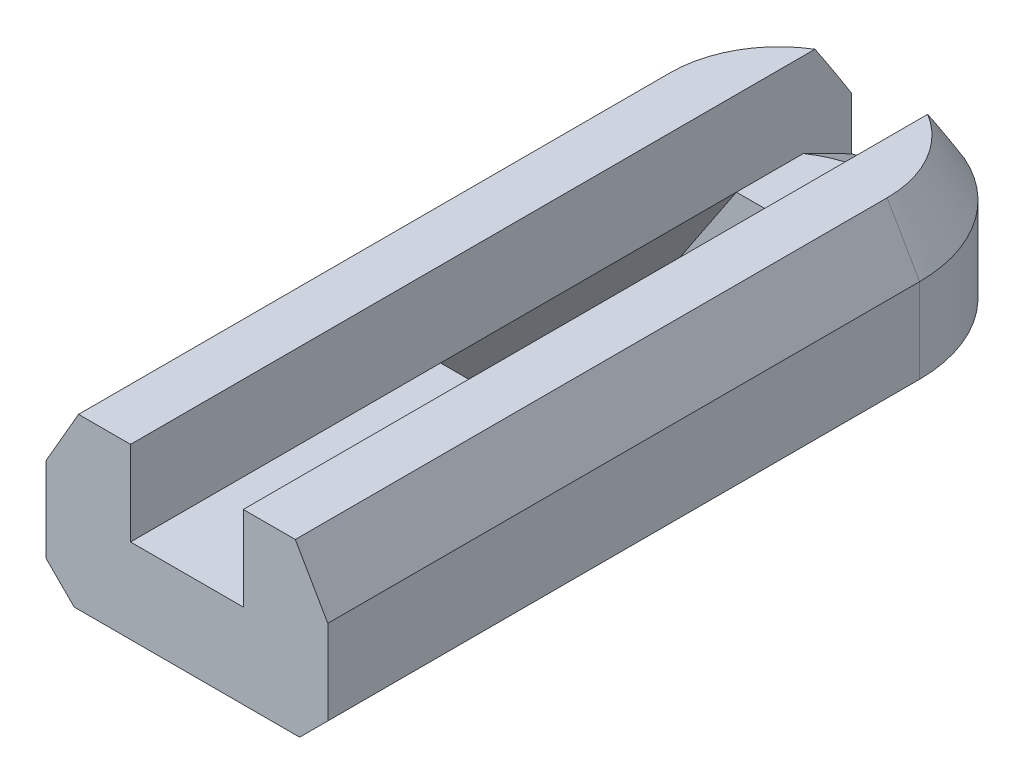
ISO-10303-21;
HEADER;
FILE_DESCRIPTION(('STEP AP214'),'2;1');
FILE_NAME('part.step','',(''),(''),'','','');
FILE_SCHEMA(('AUTOMOTIVE_DESIGN { 1 0 10303 214 1 1 1 1 }'));
ENDSEC;
DATA;
#1=APPLICATION_CONTEXT('core data for automotive mechanical design processes');
#2=APPLICATION_PROTOCOL_DEFINITION('international standard','automotive_design',2000,#1);
#3=PRODUCT_CONTEXT('',#1,'mechanical');
#4=PRODUCT('Part','Part','',(#3));
#5=PRODUCT_RELATED_PRODUCT_CATEGORY('part','',(#4));
#6=PRODUCT_DEFINITION_FORMATION('','',#4);
#7=PRODUCT_DEFINITION_CONTEXT('part definition',#1,'design');
#8=PRODUCT_DEFINITION('design','',#6,#7);
#9=PRODUCT_DEFINITION_SHAPE('','',#8);
#10=(LENGTH_UNIT() NAMED_UNIT(*) SI_UNIT(.MILLI.,.METRE.));
#11=(NAMED_UNIT(*) PLANE_ANGLE_UNIT() SI_UNIT($,.RADIAN.));
#12=(NAMED_UNIT(*) SI_UNIT($,.STERADIAN.) SOLID_ANGLE_UNIT());
#13=UNCERTAINTY_MEASURE_WITH_UNIT(LENGTH_MEASURE(1.E-05),#10,'distance_accuracy_value','');
#14=(GEOMETRIC_REPRESENTATION_CONTEXT(3) GLOBAL_UNCERTAINTY_ASSIGNED_CONTEXT((#13)) GLOBAL_UNIT_ASSIGNED_CONTEXT((#10,
#11,#12)) REPRESENTATION_CONTEXT('',''));
#15=CARTESIAN_POINT('',(0.,0.,0.));
#16=DIRECTION('',(0.,0.,1.));
#17=DIRECTION('',(1.,0.,0.));
#18=AXIS2_PLACEMENT_3D('',#15,#16,#17);
#19=CARTESIAN_POINT('',(-5.,0.,26.));
#20=DIRECTION('',(0.,1.,0.));
#21=DIRECTION('',(0.,0.,1.));
#22=AXIS2_PLACEMENT_3D('',#19,#20,#21);
#23=PLANE('',#22);
#24=DIRECTION('',(1.,0.,0.));
#25=VECTOR('',#24,1.);
#26=CARTESIAN_POINT('',(-7.,0.,18.));
#27=LINE('',#26,#25);
#28=CARTESIAN_POINT('',(-3.99999999999999,0.,18.));
#29=VERTEX_POINT('',#28);
#30=CARTESIAN_POINT('',(3.99999999999999,0.,18.));
#31=VERTEX_POINT('',#30);
#32=EDGE_CURVE('E52',#29,#31,#27,.T.);
#33=ORIENTED_EDGE('',*,*,#32,.T.);
#34=DIRECTION('',(0.,0.,1.));
#35=VECTOR('',#34,1.);
#36=CARTESIAN_POINT('',(4.,0.,26.));
#37=LINE('',#36,#35);
#38=CARTESIAN_POINT('',(3.99999999999999,0.,26.));
#39=VERTEX_POINT('',#38);
#40=EDGE_CURVE('E172',#31,#39,#37,.T.);
#41=ORIENTED_EDGE('',*,*,#40,.T.);
#42=DIRECTION('',(1.,0.,0.));
#43=VECTOR('',#42,1.);
#44=CARTESIAN_POINT('',(-5.,0.,26.));
#45=LINE('',#44,#43);
#46=CARTESIAN_POINT('',(-4.,0.,26.));
#47=VERTEX_POINT('',#46);
#48=EDGE_CURVE('E415',#47,#39,#45,.T.);
#49=ORIENTED_EDGE('',*,*,#48,.F.);
#50=DIRECTION('',(0.,0.,-1.));
#51=VECTOR('',#50,1.);
#52=CARTESIAN_POINT('',(-4.,0.,26.));
#53=LINE('',#52,#51);
#54=EDGE_CURVE('E175',#47,#29,#53,.T.);
#55=ORIENTED_EDGE('',*,*,#54,.T.);
#56=EDGE_LOOP('',(#33,#41,#49,#55));
#57=FACE_BOUND('',#56,.T.);
#58=ADVANCED_FACE('F31',(#57),#23,.F.);
#59=CARTESIAN_POINT('',(2.,6.,26.));
#60=DIRECTION('',(1.,0.,0.));
#61=DIRECTION('',(0.,1.,0.));
#62=AXIS2_PLACEMENT_3D('',#59,#60,#61);
#63=PLANE('',#62);
#64=DIRECTION('',(0.,0.,-1.));
#65=VECTOR('',#64,1.);
#66=CARTESIAN_POINT('',(2.,3.,26.));
#67=LINE('',#66,#65);
#68=CARTESIAN_POINT('',(2.,2.99999999999999,15.));
#69=VERTEX_POINT('',#68);
#70=CARTESIAN_POINT('',(2.,2.99999999999999,4.5));
#71=VERTEX_POINT('',#70);
#72=EDGE_CURVE('E336',#69,#71,#67,.T.);
#73=ORIENTED_EDGE('',*,*,#72,.F.);
#74=CARTESIAN_POINT('',(2.,3.,26.));
#75=VERTEX_POINT('',#74);
#76=EDGE_CURVE('E206',#75,#69,#67,.T.);
#77=ORIENTED_EDGE('',*,*,#76,.F.);
#78=DIRECTION('',(0.,-1.,0.));
#79=VECTOR('',#78,1.);
#80=CARTESIAN_POINT('',(2.,6.,26.));
#81=LINE('',#80,#79);
#82=CARTESIAN_POINT('',(2.,6.,26.));
#83=VERTEX_POINT('',#82);
#84=EDGE_CURVE('E436',#83,#75,#81,.T.);
#85=ORIENTED_EDGE('',*,*,#84,.F.);
#86=DIRECTION('',(0.,0.,-1.));
#87=VECTOR('',#86,1.);
#88=CARTESIAN_POINT('',(2.,6.,26.));
#89=LINE('',#88,#87);
#90=CARTESIAN_POINT('',(2.,6.,1.71574544994747));
#91=VERTEX_POINT('',#90);
#92=EDGE_CURVE('E204',#83,#91,#89,.T.);
#93=ORIENTED_EDGE('',*,*,#92,.T.);
#94=CARTESIAN_POINT('',(2.,6.,1.71574544994747));
#95=CARTESIAN_POINT('',(2.,5.83534489707042,1.60447881727479));
#96=CARTESIAN_POINT('',(2.,5.67001928040619,1.4942135045292));
#97=CARTESIAN_POINT('',(2.,5.33829926672442,1.27532387593576));
#98=CARTESIAN_POINT('',(2.,5.17190493742923,1.16669945754144));
#99=CARTESIAN_POINT('',(2.,4.83830291324364,0.950718626568248));
#100=CARTESIAN_POINT('',(2.,4.67109523745757,0.843362184407559));
#101=CARTESIAN_POINT('',(2.,4.33600901475099,0.629677741844148));
#102=CARTESIAN_POINT('',(2.,4.16813042665247,0.523349805980889));
#103=CARTESIAN_POINT('',(2.,3.99999999999998,0.417424305044159));
#104=B_SPLINE_CURVE_WITH_KNOTS('',3,(#94,#95,#96,#97,#98,#99,#100,#101,#102,#103),.UNSPECIFIED.,
.F.,.F.,(4,2,2,2,4),(0.,0.596163631840075,1.1922898514524,1.78840213589578,2.38455158723646),.UNSPECIFIED.);
#105=CARTESIAN_POINT('',(2.,3.99999999999998,0.417424305044161));
#106=VERTEX_POINT('',#105);
#107=EDGE_CURVE('E239',#91,#106,#104,.T.);
#108=ORIENTED_EDGE('',*,*,#107,.T.);
#109=DIRECTION('',(0.,-1.,0.));
#110=VECTOR('',#109,1.);
#111=CARTESIAN_POINT('',(2.,6.,0.417424305044161));
#112=LINE('',#111,#110);
#113=CARTESIAN_POINT('',(2.,2.13397459621556,0.41742430504416));
#114=VERTEX_POINT('',#113);
#115=EDGE_CURVE('E422',#114,#106,#112,.F.);
#116=ORIENTED_EDGE('',*,*,#115,.F.);
#117=CARTESIAN_POINT('',(2.,2.13397459621556,0.41742430504416));
#118=CARTESIAN_POINT('',(2.,2.20868597557332,0.558650213129735));
#119=CARTESIAN_POINT('',(2.,2.28299510150788,0.700091397082575));
#120=CARTESIAN_POINT('',(2.,2.43048147834879,0.983541451970394));
#121=CARTESIAN_POINT('',(2.,2.50365885854891,1.12555025569111));
#122=CARTESIAN_POINT('',(2.,2.64857580875354,1.41031315724276));
#123=CARTESIAN_POINT('',(2.,2.72031529740865,1.55306729666873));
#124=CARTESIAN_POINT('',(2.,2.86179796351195,1.83958052296698));
#125=CARTESIAN_POINT('',(2.,2.93154090747584,1.98333972494936));
#126=CARTESIAN_POINT('',(2.,3.,2.127718676731));
#127=B_SPLINE_CURVE_WITH_KNOTS('',3,(#117,#118,#119,#120,#121,#122,#123,#124,#125,#126),
.UNSPECIFIED.,.F.,.F.,(4,2,2,2,4),(0.,0.479313205082431,0.958571241474229,1.43785631601549,
1.91719721307088),.UNSPECIFIED.);
#128=CARTESIAN_POINT('',(2.,3.,2.127718676731));
#129=VERTEX_POINT('',#128);
#130=EDGE_CURVE('E265',#114,#129,#127,.T.);
#131=ORIENTED_EDGE('',*,*,#130,.T.);
#132=EDGE_CURVE('E60',#71,#129,#67,.T.);
#133=ORIENTED_EDGE('',*,*,#132,.F.);
#134=EDGE_LOOP('',(#73,#77,#85,#93,#108,#116,#131,#133));
#135=FACE_BOUND('',#134,.T.);
#136=ADVANCED_FACE('F252',(#135),#63,.F.);
#137=CARTESIAN_POINT('',(-2.,6.,26.));
#138=DIRECTION('',(-1.,0.,0.));
#139=DIRECTION('',(0.,-1.,0.));
#140=AXIS2_PLACEMENT_3D('',#137,#138,#139);
#141=PLANE('',#140);
#142=DIRECTION('',(0.,0.,-1.));
#143=VECTOR('',#142,1.);
#144=CARTESIAN_POINT('',(-2.,3.,26.));
#145=LINE('',#144,#143);
#146=CARTESIAN_POINT('',(-2.,3.,26.));
#147=VERTEX_POINT('',#146);
#148=CARTESIAN_POINT('',(-2.,3.,15.));
#149=VERTEX_POINT('',#148);
#150=EDGE_CURVE('E443',#147,#149,#145,.T.);
#151=ORIENTED_EDGE('',*,*,#150,.T.);
#152=CARTESIAN_POINT('',(-2.,3.,4.5));
#153=VERTEX_POINT('',#152);
#154=EDGE_CURVE('E445',#149,#153,#145,.T.);
#155=ORIENTED_EDGE('',*,*,#154,.T.);
#156=CARTESIAN_POINT('',(-2.,3.,2.127718676731));
#157=VERTEX_POINT('',#156);
#158=EDGE_CURVE('E442',#153,#157,#145,.T.);
#159=ORIENTED_EDGE('',*,*,#158,.T.);
#160=CARTESIAN_POINT('',(-2.,3.,2.127718676731));
#161=CARTESIAN_POINT('',(-2.,2.93154090747584,1.98333972494936));
#162=CARTESIAN_POINT('',(-2.,2.86179796351195,1.83958052296698));
#163=CARTESIAN_POINT('',(-2.,2.72031529740865,1.55306729666873));
#164=CARTESIAN_POINT('',(-2.,2.64857580875354,1.41031315724276));
#165=CARTESIAN_POINT('',(-2.,2.50365885854891,1.12555025569111));
#166=CARTESIAN_POINT('',(-2.,2.43048147834879,0.983541451970395));
#167=CARTESIAN_POINT('',(-2.,2.28299510150788,0.700091397082574));
#168=CARTESIAN_POINT('',(-2.,2.20868597557333,0.558650213129731));
#169=CARTESIAN_POINT('',(-2.,2.13397459621558,0.417424305044151));
#170=B_SPLINE_CURVE_WITH_KNOTS('',3,(#160,#161,#162,#163,#164,#165,#166,#167,#168,#169),
.UNSPECIFIED.,.F.,.F.,(4,2,2,2,4),(0.,0.479340897055393,0.958625971596654,1.43788400798845,
1.91719721307088),.UNSPECIFIED.);
#171=CARTESIAN_POINT('',(-2.,2.13397459621556,0.417424305044161));
#172=VERTEX_POINT('',#171);
#173=EDGE_CURVE('E270',#157,#172,#170,.T.);
#174=ORIENTED_EDGE('',*,*,#173,.T.);
#175=DIRECTION('',(0.,-1.,0.));
#176=VECTOR('',#175,1.);
#177=CARTESIAN_POINT('',(-2.,6.,0.417424305044161));
#178=LINE('',#177,#176);
#179=CARTESIAN_POINT('',(-2.,3.99999999999998,0.417424305044161));
#180=VERTEX_POINT('',#179);
#181=EDGE_CURVE('E427',#180,#172,#178,.T.);
#182=ORIENTED_EDGE('',*,*,#181,.F.);
#183=CARTESIAN_POINT('',(-2.,3.99999999999998,0.41742430504416));
#184=CARTESIAN_POINT('',(-2.,4.16813042665247,0.523349805980891));
#185=CARTESIAN_POINT('',(-2.,4.33600901475099,0.629677741844149));
#186=CARTESIAN_POINT('',(-2.,4.67109523745757,0.84336218440756));
#187=CARTESIAN_POINT('',(-2.,4.83830291324364,0.950718626568249));
#188=CARTESIAN_POINT('',(-2.,5.17190493742923,1.16669945754145));
#189=CARTESIAN_POINT('',(-2.,5.33829926672442,1.27532387593576));
#190=CARTESIAN_POINT('',(-2.,5.67001928040619,1.4942135045292));
#191=CARTESIAN_POINT('',(-2.,5.83534489707042,1.60447881727479));
#192=CARTESIAN_POINT('',(-2.,6.,1.71574544994746));
#193=B_SPLINE_CURVE_WITH_KNOTS('',3,(#183,#184,#185,#186,#187,#188,#189,#190,#191,#192),
.UNSPECIFIED.,.F.,.F.,(4,2,2,2,4),(0.,0.596149451340681,1.19226173578406,1.78838795539638,
2.38455158723646),.UNSPECIFIED.);
#194=CARTESIAN_POINT('',(-2.,6.,1.71574544994746));
#195=VERTEX_POINT('',#194);
#196=EDGE_CURVE('E286',#180,#195,#193,.T.);
#197=ORIENTED_EDGE('',*,*,#196,.T.);
#198=DIRECTION('',(0.,0.,-1.));
#199=VECTOR('',#198,1.);
#200=CARTESIAN_POINT('',(-2.,6.,26.));
#201=LINE('',#200,#199);
#202=CARTESIAN_POINT('',(-2.,6.,26.));
#203=VERTEX_POINT('',#202);
#204=EDGE_CURVE('E386',#203,#195,#201,.T.);
#205=ORIENTED_EDGE('',*,*,#204,.F.);
#206=DIRECTION('',(0.,1.,0.));
#207=VECTOR('',#206,1.);
#208=CARTESIAN_POINT('',(-2.,6.,26.));
#209=LINE('',#208,#207);
#210=EDGE_CURVE('E382',#147,#203,#209,.T.);
#211=ORIENTED_EDGE('',*,*,#210,.F.);
#212=EDGE_LOOP('',(#151,#155,#159,#174,#182,#197,#205,#211));
#213=FACE_BOUND('',#212,.T.);
#214=ADVANCED_FACE('F257',(#213),#141,.F.);
#215=CARTESIAN_POINT('',(0.,0.,5.));
#216=DIRECTION('',(0.,1.,0.));
#217=DIRECTION('',(0.,0.,1.));
#218=AXIS2_PLACEMENT_3D('',#215,#216,#217);
#219=CONICAL_SURFACE('',#218,4.,0.78539816339745);
#220=CARTESIAN_POINT('',(-8.83755464897912,4.8516875325382,4.5));
#221=CARTESIAN_POINT('',(-8.53683471264069,4.55145150941046,4.5));
#222=CARTESIAN_POINT('',(-8.23609386275405,4.25123641990356,4.5));
#223=CARTESIAN_POINT('',(-7.6345404633063,3.65087142499788,4.5));
#224=CARTESIAN_POINT('',(-7.3337279129883,3.35072152035752,4.5));
#225=CARTESIAN_POINT('',(-6.73193324167959,2.75044239328245,4.5));
#226=CARTESIAN_POINT('',(-6.43095109713368,2.45031319446115,4.5));
#227=CARTESIAN_POINT('',(-5.82884727015146,1.85020126658067,4.5));
#228=CARTESIAN_POINT('',(-5.52772558925711,1.55021853597477,4.5));
#229=CARTESIAN_POINT('',(-4.9151830782557,0.940460212751902,4.5));
#230=CARTESIAN_POINT('',(-4.60375444038674,0.630692463381141,4.5));
#231=CARTESIAN_POINT('',(-3.98046228128322,0.0115744102832699,4.5));
#232=CARTESIAN_POINT('',(-3.66859874646283,-0.297775879780524,4.5));
#233=CARTESIAN_POINT('',(-3.20015647176259,-0.76109775253928,4.5));
#234=CARTESIAN_POINT('',(-3.04391371627375,-0.915408826333437,4.5));
#235=CARTESIAN_POINT('',(-2.73106752559852,-1.2236690325921,4.5));
#236=CARTESIAN_POINT('',(-2.5744640857508,-1.37761816032642,4.5));
#237=CARTESIAN_POINT('',(-2.26068053114651,-1.6849104757283,4.5));
#238=CARTESIAN_POINT('',(-2.10350045131061,-1.83825369895768,4.5));
#239=CARTESIAN_POINT('',(-1.86689590205629,-2.0674041836254,4.5));
#240=CARTESIAN_POINT('',(-1.78788948374197,-2.14364282188753,4.5));
#241=CARTESIAN_POINT('',(-1.6294672871328,-2.29569329346207,4.5));
#242=CARTESIAN_POINT('',(-1.55005151201252,-2.37150513007484,4.5));
#243=CARTESIAN_POINT('',(-1.42740818792968,-2.48761583543631,4.5));
#244=CARTESIAN_POINT('',(-1.38440274590367,-2.52814917063097,4.5));
#245=CARTESIAN_POINT('',(-1.29815516236271,-2.60896471046319,4.5));
#246=CARTESIAN_POINT('',(-1.25491301726766,-2.64924691128257,4.5));
#247=CARTESIAN_POINT('',(-1.16826241335084,-2.72934522785627,4.5));
#248=CARTESIAN_POINT('',(-1.1248549731161,-2.76916244250569,4.5));
#249=CARTESIAN_POINT('',(-1.03762438834593,-2.84833530394372,4.5));
#250=CARTESIAN_POINT('',(-0.993801258357909,-2.88769096677772,4.5));
#251=CARTESIAN_POINT('',(-0.890625032950921,-2.97900042247183,4.5));
#252=CARTESIAN_POINT('',(-0.831044896564961,-3.03070077965003,4.5));
#253=CARTESIAN_POINT('',(-0.740213678523146,-3.10688836818385,4.5));
#254=CARTESIAN_POINT('',(-0.709598168955247,-3.13213141372374,4.5));
#255=CARTESIAN_POINT('',(-0.647788882048885,-3.18189717302618,4.5));
#256=CARTESIAN_POINT('',(-0.616595158821892,-3.20641995364431,4.5));
#257=CARTESIAN_POINT('',(-0.553043885626938,-3.25473131636517,4.5));
#258=CARTESIAN_POINT('',(-0.520676848927657,-3.27850751620587,4.5));
#259=CARTESIAN_POINT('',(-0.454787917080592,-3.32452022161045,4.5));
#260=CARTESIAN_POINT('',(-0.421264554434108,-3.3467546541266,4.5));
#261=CARTESIAN_POINT('',(-0.352955934038898,-3.38856462123039,4.5));
#262=CARTESIAN_POINT('',(-0.318183781820921,-3.40816109688275,4.5));
#263=CARTESIAN_POINT('',(-0.246706006330425,-3.44331790386661,4.5));
#264=CARTESIAN_POINT('',(-0.21000662176797,-3.45889039627751,4.5));
#265=CARTESIAN_POINT('',(-0.137639850081398,-3.48241026918161,4.5));
#266=CARTESIAN_POINT('',(-0.102165834604286,-3.49090805479092,4.5));
#267=CARTESIAN_POINT('',(-0.0483186583445321,-3.49798751946807,4.5));
#268=CARTESIAN_POINT('',(-0.0303097751418469,-3.49940630153996,4.5));
#269=CARTESIAN_POINT('',(0.00575454203758944,-3.50029226415108,4.5));
#270=CARTESIAN_POINT('',(0.0238099753291141,-3.49975947325578,4.5));
#271=CARTESIAN_POINT('',(0.0775964424536678,-3.49526380069328,4.5));
#272=CARTESIAN_POINT('',(0.113112474902156,-3.48842499223845,4.5));
#273=CARTESIAN_POINT('',(0.165133710126672,-3.47370930133085,4.5));
#274=CARTESIAN_POINT('',(0.182337435648279,-3.46802654486702,4.5));
#275=CARTESIAN_POINT('',(0.216297469342861,-3.45544673176378,4.5));
#276=CARTESIAN_POINT('',(0.233053837715159,-3.44854983946468,4.5));
#277=CARTESIAN_POINT('',(0.277726651140939,-3.4286028874643,4.5));
#278=CARTESIAN_POINT('',(0.305226789296734,-3.41463014425626,4.5));
#279=CARTESIAN_POINT('',(0.359179203830826,-3.38477195293045,4.5));
#280=CARTESIAN_POINT('',(0.385630317453692,-3.36888445710886,4.5));
#281=CARTESIAN_POINT('',(0.437774578865679,-3.3357408404807,4.5));
#282=CARTESIAN_POINT('',(0.463464955248574,-3.31848040054905,4.5));
#283=CARTESIAN_POINT('',(0.514189998977541,-3.28301711106529,4.5));
#284=CARTESIAN_POINT('',(0.539224505455236,-3.26481403350714,4.5));
#285=CARTESIAN_POINT('',(0.614012242837509,-3.20886254735938,4.5));
#286=CARTESIAN_POINT('',(0.662988034359709,-3.17007943699375,4.5));
#287=CARTESIAN_POINT('',(0.759550126099101,-3.09106612535659,4.5));
#288=CARTESIAN_POINT('',(0.807139320049248,-3.05083939764371,4.5));
#289=CARTESIAN_POINT('',(0.90048968388462,-2.97027289700883,4.5));
#290=CARTESIAN_POINT('',(0.94626825521838,-2.9299532403695,4.5));
#291=CARTESIAN_POINT('',(1.03726905684131,-2.84869125719068,4.5));
#292=CARTESIAN_POINT('',(1.08249127193485,-2.80774891371189,4.5));
#293=CARTESIAN_POINT('',(1.21758206923575,-2.68426659167721,4.5));
#294=CARTESIAN_POINT('',(1.30686144484875,-2.60108307275638,4.5));
#295=CARTESIAN_POINT('',(1.48465208729688,-2.43369385792876,4.5));
#296=CARTESIAN_POINT('',(1.57316230991431,-2.34948706028655,4.5));
#297=CARTESIAN_POINT('',(1.74962746861016,-2.18050834148748,4.5));
#298=CARTESIAN_POINT('',(1.83758244963931,-2.0957364672502,4.5));
#299=CARTESIAN_POINT('',(2.012249571878,-1.92667550935954,4.5));
#300=CARTESIAN_POINT('',(2.09896531694972,-1.84239014281696,4.5));
#301=CARTESIAN_POINT('',(2.27215168266104,-1.67356438190961,4.5));
#302=CARTESIAN_POINT('',(2.35862229805216,-1.58902398216314,4.5));
#303=CARTESIAN_POINT('',(2.61768489316685,-1.33521772557765,4.5));
#304=CARTESIAN_POINT('',(2.79001359970387,-1.16568327465836,4.5));
#305=CARTESIAN_POINT('',(3.20572866667051,-0.755765315261996,4.5));
#306=CARTESIAN_POINT('',(3.4489188724809,-0.515183119036116,4.5));
#307=CARTESIAN_POINT('',(3.93488783192138,-0.0336021177175214,4.5));
#308=CARTESIAN_POINT('',(4.17766658409519,0.207396688843666,4.5));
#309=CARTESIAN_POINT('',(4.90574999218619,0.93085484718254,4.5));
#310=CARTESIAN_POINT('',(5.39069790454066,1.41367310875697,4.5));
#311=CARTESIAN_POINT('',(6.36948358457613,2.38894826477118,4.5));
#312=CARTESIAN_POINT('',(6.86331380472617,2.88141272721064,4.5));
#313=CARTESIAN_POINT('',(7.85062577818063,3.86646908507023,4.5));
#314=CARTESIAN_POINT('',(8.34410758485001,4.35906092699711,4.5));
#315=CARTESIAN_POINT('',(8.83755464897912,4.85168753253819,4.5));
#316=B_SPLINE_CURVE_WITH_KNOTS('',3,(#220,#221,#222,#223,#224,#225,#226,#227,#228,#229,#230,
#231,#232,#233,#234,#235,#236,#237,#238,#239,#240,#241,#242,#243,#244,#245,#246,#247,#248,#249,
#250,#251,#252,#253,#254,#255,#256,#257,#258,#259,#260,#261,#262,#263,#264,#265,#266,#267,#268,
#269,#270,#271,#272,#273,#274,#275,#276,#277,#278,#279,#280,#281,#282,#283,#284,#285,#286,#287,
#288,#289,#290,#291,#292,#293,#294,#295,#296,#297,#298,#299,#300,#301,#302,#303,#304,#305,#306,
#307,#308,#309,#310,#311,#312,#313,#314,#315),.UNSPECIFIED.,.F.,.F.,(4,2,2,2,2,2,2,2,2,2,2,2,2,
2,2,2,2,2,2,2,2,2,2,2,2,2,2,2,2,2,2,2,2,2,2,2,2,2,2,2,2,2,2,2,2,2,2,4),(0.,1.27482052991364,
2.5496551728158,3.82480615371172,5.09994336437428,6.41770449240991,7.73550775219501,
8.39430421140242,9.05310923292499,9.71187499567518,10.0412509402736,10.3706243343837,
10.5479136443031,10.7252056431484,10.9019130319167,11.0786142593095,11.3152348821607,
11.4342682124787,11.5532904588822,11.6737446233532,11.7943577289623,11.9139484320101,
12.0331733716041,12.1419067935948,12.19600139881,12.2500952122372,12.3577948702902,
12.4121197798332,12.4664373418308,12.5588553925105,12.651373170262,12.7441944765077,
12.8370383402882,13.0243874985071,13.2113126651367,13.3943121599596,13.5773166419609,
13.9433789702869,14.3098783083676,14.6763475851254,15.0391317502488,15.4019236251488,
16.1271477464346,17.1533980005792,18.1796518794654,20.2325981698715,22.3248471319122,
24.4166259987158),.UNSPECIFIED.);
#317=CARTESIAN_POINT('',(-3.98750975039595,0.0187353744060782,4.5));
#318=VERTEX_POINT('',#317);
#319=CARTESIAN_POINT('',(-3.96862696659688,0.,4.5));
#320=VERTEX_POINT('',#319);
#321=EDGE_CURVE('E11',#318,#320,#316,.T.);
#322=ORIENTED_EDGE('',*,*,#321,.F.);
#323=CARTESIAN_POINT('',(-3.98749976399376,0.018750354009356,4.4998));
#324=CARTESIAN_POINT('',(-3.99166272954396,0.0125059056840541,4.58303106599498));
#325=CARTESIAN_POINT('',(-3.99478589848401,0.0078211522739743,4.66634654956204));
#326=CARTESIAN_POINT('',(-3.99895264807304,0.00157102789044128,4.83314654916258));
#327=CARTESIAN_POINT('',(-3.99999622380173,5.66429740265551E-06,4.91663106559552));
#328=CARTESIAN_POINT('',(-3.999999998,3.000000836347E-09,5.0002));
#329=B_SPLINE_CURVE_WITH_KNOTS('',3,(#323,#324,#325,#326,#327,#328),.UNSPECIFIED.,.F.,.F.,(4,2,
4),(0.,0.25051654258109,0.501033677878663),.UNSPECIFIED.);
#330=CARTESIAN_POINT('',(-4.,0.,5.));
#331=VERTEX_POINT('',#330);
#332=EDGE_CURVE('E350',#318,#331,#329,.T.);
#333=ORIENTED_EDGE('',*,*,#332,.T.);
#334=DIRECTION('',(0.707106781186549,-0.707106781186546,0.));
#335=VECTOR('',#334,1.);
#336=CARTESIAN_POINT('',(-5.,1.,5.));
#337=LINE('',#336,#335);
#338=CARTESIAN_POINT('',(-5.,1.,5.));
#339=VERTEX_POINT('',#338);
#340=EDGE_CURVE('E226',#339,#331,#337,.T.);
#341=ORIENTED_EDGE('',*,*,#340,.F.);
#342=CARTESIAN_POINT('',(0.,1.,5.));
#343=DIRECTION('',(0.,1.,0.));
#344=DIRECTION('',(0.,0.,1.));
#345=AXIS2_PLACEMENT_3D('',#342,#343,#344);
#346=CIRCLE('',#345,5.);
#347=CARTESIAN_POINT('',(5.,1.,5.));
#348=VERTEX_POINT('',#347);
#349=EDGE_CURVE('E219',#348,#339,#346,.T.);
#350=ORIENTED_EDGE('',*,*,#349,.F.);
#351=DIRECTION('',(-0.707106781186549,-0.707106781186546,0.));
#352=VECTOR('',#351,1.);
#353=CARTESIAN_POINT('',(5.,1.,5.));
#354=LINE('',#353,#352);
#355=CARTESIAN_POINT('',(3.99999999999999,0.,5.));
#356=VERTEX_POINT('',#355);
#357=EDGE_CURVE('E229',#348,#356,#354,.T.);
#358=ORIENTED_EDGE('',*,*,#357,.T.);
#359=CARTESIAN_POINT('',(3.99999999799999,2.99999707416359E-09,5.0002));
#360=CARTESIAN_POINT('',(3.99999622380173,5.66429739890318E-06,4.91663106559552));
#361=CARTESIAN_POINT('',(3.99895264807303,0.00157102789043748,4.83314654916258));
#362=CARTESIAN_POINT('',(3.99478589848401,0.00782115227397028,4.66634654956204));
#363=CARTESIAN_POINT('',(3.99166272954396,0.0125059056840499,4.58303106599498));
#364=CARTESIAN_POINT('',(3.98749976399376,0.0187503540093516,4.4998));
#365=B_SPLINE_CURVE_WITH_KNOTS('',3,(#359,#360,#361,#362,#363,#364),.UNSPECIFIED.,.F.,.F.,(4,2,
4),(0.,0.250517135297573,0.501033677878663),.UNSPECIFIED.);
#366=CARTESIAN_POINT('',(3.98750975039594,0.0187353744060745,4.5));
#367=VERTEX_POINT('',#366);
#368=EDGE_CURVE('E188',#356,#367,#365,.T.);
#369=ORIENTED_EDGE('',*,*,#368,.T.);
#370=CARTESIAN_POINT('',(3.96862696659688,0.,4.5));
#371=VERTEX_POINT('',#370);
#372=EDGE_CURVE('E36',#371,#367,#316,.T.);
#373=ORIENTED_EDGE('',*,*,#372,.F.);
#374=CARTESIAN_POINT('',(0.,0.,5.));
#375=DIRECTION('',(0.,1.,0.));
#376=DIRECTION('',(0.,0.,1.));
#377=AXIS2_PLACEMENT_3D('',#374,#375,#376);
#378=CIRCLE('',#377,4.);
#379=EDGE_CURVE('E192',#320,#371,#378,.F.);
#380=ORIENTED_EDGE('',*,*,#379,.F.);
#381=EDGE_LOOP('',(#322,#333,#341,#350,#358,#369,#373,#380));
#382=FACE_BOUND('',#381,.T.);
#383=ADVANCED_FACE('F280',(#382),#219,.T.);
#384=CARTESIAN_POINT('',(-2.,3.,26.));
#385=DIRECTION('',(0.,-1.,0.));
#386=DIRECTION('',(0.,0.,-1.));
#387=AXIS2_PLACEMENT_3D('',#384,#385,#386);
#388=PLANE('',#387);
#389=ORIENTED_EDGE('',*,*,#158,.F.);
#390=DIRECTION('',(1.,0.,0.));
#391=VECTOR('',#390,1.);
#392=CARTESIAN_POINT('',(-2.,3.,4.5));
#393=LINE('',#392,#391);
#394=EDGE_CURVE('E455',#153,#71,#393,.T.);
#395=ORIENTED_EDGE('',*,*,#394,.T.);
#396=ORIENTED_EDGE('',*,*,#132,.T.);
#397=CARTESIAN_POINT('',(0.,3.,5.));
#398=DIRECTION('',(0.,-1.,0.));
#399=DIRECTION('',(0.,0.,-1.));
#400=AXIS2_PLACEMENT_3D('',#397,#398,#399);
#401=CIRCLE('',#400,3.49999999999999);
#402=EDGE_CURVE('E271',#129,#157,#401,.F.);
#403=ORIENTED_EDGE('',*,*,#402,.T.);
#404=EDGE_LOOP('',(#389,#395,#396,#403));
#405=FACE_BOUND('',#404,.T.);
#406=ADVANCED_FACE('F318',(#405),#388,.F.);
#407=ORIENTED_EDGE('',*,*,#379,.T.);
#408=DIRECTION('',(1.,0.,0.));
#409=VECTOR('',#408,1.);
#410=CARTESIAN_POINT('',(-4.,0.,4.5));
#411=LINE('',#410,#409);
#412=EDGE_CURVE('E198',#320,#371,#411,.T.);
#413=ORIENTED_EDGE('',*,*,#412,.F.);
#414=EDGE_LOOP('',(#407,#413));
#415=FACE_BOUND('',#414,.T.);
#416=ADVANCED_FACE('F312',(#415),#23,.F.);
#417=CARTESIAN_POINT('',(5.,0.,26.));
#418=DIRECTION('',(-1.,0.,0.));
#419=DIRECTION('',(0.,0.,1.));
#420=AXIS2_PLACEMENT_3D('',#417,#418,#419);
#421=PLANE('',#420);
#422=DIRECTION('',(0.,-1.,0.));
#423=VECTOR('',#422,1.);
#424=CARTESIAN_POINT('',(5.,6.,5.));
#425=LINE('',#424,#423);
#426=CARTESIAN_POINT('',(5.,3.99999999999998,5.));
#427=VERTEX_POINT('',#426);
#428=EDGE_CURVE('E232',#427,#348,#425,.T.);
#429=ORIENTED_EDGE('',*,*,#428,.F.);
#430=DIRECTION('',(0.,0.,1.));
#431=VECTOR('',#430,1.);
#432=CARTESIAN_POINT('',(5.,3.99999999999998,26.));
#433=LINE('',#432,#431);
#434=CARTESIAN_POINT('',(5.,3.99999999999998,26.));
#435=VERTEX_POINT('',#434);
#436=EDGE_CURVE('E246',#427,#435,#433,.T.);
#437=ORIENTED_EDGE('',*,*,#436,.T.);
#438=DIRECTION('',(0.,1.,0.));
#439=VECTOR('',#438,1.);
#440=CARTESIAN_POINT('',(5.,0.,26.));
#441=LINE('',#440,#439);
#442=CARTESIAN_POINT('',(5.,1.,26.));
#443=VERTEX_POINT('',#442);
#444=EDGE_CURVE('E412',#443,#435,#441,.T.);
#445=ORIENTED_EDGE('',*,*,#444,.F.);
#446=DIRECTION('',(0.,0.,-1.));
#447=VECTOR('',#446,1.);
#448=CARTESIAN_POINT('',(5.,1.,26.));
#449=LINE('',#448,#447);
#450=EDGE_CURVE('E222',#443,#348,#449,.T.);
#451=ORIENTED_EDGE('',*,*,#450,.T.);
#452=EDGE_LOOP('',(#429,#437,#445,#451));
#453=FACE_BOUND('',#452,.T.);
#454=ADVANCED_FACE('F317',(#453),#421,.F.);
#455=CARTESIAN_POINT('',(5.,6.,26.));
#456=DIRECTION('',(0.,-1.,0.));
#457=DIRECTION('',(0.,0.,-1.));
#458=AXIS2_PLACEMENT_3D('',#455,#456,#457);
#459=PLANE('',#458);
#460=DIRECTION('',(0.,0.,-1.));
#461=VECTOR('',#460,1.);
#462=CARTESIAN_POINT('',(3.84529946162074,6.,26.));
#463=LINE('',#462,#461);
#464=CARTESIAN_POINT('',(3.84529946162074,6.,26.));
#465=VERTEX_POINT('',#464);
#466=CARTESIAN_POINT('',(3.84529946162074,6.,5.));
#467=VERTEX_POINT('',#466);
#468=EDGE_CURVE('E235',#465,#467,#463,.T.);
#469=ORIENTED_EDGE('',*,*,#468,.T.);
#470=CARTESIAN_POINT('',(0.,6.,5.));
#471=DIRECTION('',(0.,-1.,0.));
#472=DIRECTION('',(0.,0.,-1.));
#473=AXIS2_PLACEMENT_3D('',#470,#471,#472);
#474=CIRCLE('',#473,3.84529946162074);
#475=EDGE_CURVE('E237',#467,#91,#474,.F.);
#476=ORIENTED_EDGE('',*,*,#475,.T.);
#477=ORIENTED_EDGE('',*,*,#92,.F.);
#478=DIRECTION('',(-1.,0.,0.));
#479=VECTOR('',#478,1.);
#480=CARTESIAN_POINT('',(5.,6.,26.));
#481=LINE('',#480,#479);
#482=EDGE_CURVE('E414',#465,#83,#481,.T.);
#483=ORIENTED_EDGE('',*,*,#482,.F.);
#484=EDGE_LOOP('',(#469,#476,#477,#483));
#485=FACE_BOUND('',#484,.T.);
#486=ADVANCED_FACE('F261',(#485),#459,.F.);
#487=ORIENTED_EDGE('',*,*,#76,.T.);
#488=DIRECTION('',(1.,0.,0.));
#489=VECTOR('',#488,1.);
#490=CARTESIAN_POINT('',(-7.,3.,15.));
#491=LINE('',#490,#489);
#492=EDGE_CURVE('E177',#149,#69,#491,.T.);
#493=ORIENTED_EDGE('',*,*,#492,.F.);
#494=ORIENTED_EDGE('',*,*,#150,.F.);
#495=DIRECTION('',(-1.,0.,0.));
#496=VECTOR('',#495,1.);
#497=CARTESIAN_POINT('',(-2.,3.,26.));
#498=LINE('',#497,#496);
#499=EDGE_CURVE('E438',#75,#147,#498,.T.);
#500=ORIENTED_EDGE('',*,*,#499,.F.);
#501=EDGE_LOOP('',(#487,#493,#494,#500));
#502=FACE_BOUND('',#501,.T.);
#503=ADVANCED_FACE('F259',(#502),#388,.F.);
#504=CARTESIAN_POINT('',(-5.,6.,26.));
#505=DIRECTION('',(0.,-1.,0.));
#506=DIRECTION('',(0.,0.,-1.));
#507=AXIS2_PLACEMENT_3D('',#504,#505,#506);
#508=PLANE('',#507);
#509=ORIENTED_EDGE('',*,*,#204,.T.);
#510=CARTESIAN_POINT('',(0.,6.,5.));
#511=DIRECTION('',(0.,-1.,0.));
#512=DIRECTION('',(0.,0.,-1.));
#513=AXIS2_PLACEMENT_3D('',#510,#511,#512);
#514=CIRCLE('',#513,3.84529946162074);
#515=CARTESIAN_POINT('',(-3.84529946162074,6.,5.));
#516=VERTEX_POINT('',#515);
#517=EDGE_CURVE('E396',#195,#516,#514,.F.);
#518=ORIENTED_EDGE('',*,*,#517,.T.);
#519=DIRECTION('',(0.,0.,1.));
#520=VECTOR('',#519,1.);
#521=CARTESIAN_POINT('',(-3.84529946162074,6.,26.));
#522=LINE('',#521,#520);
#523=CARTESIAN_POINT('',(-3.84529946162074,6.,26.));
#524=VERTEX_POINT('',#523);
#525=EDGE_CURVE('E293',#516,#524,#522,.T.);
#526=ORIENTED_EDGE('',*,*,#525,.T.);
#527=DIRECTION('',(-1.,0.,0.));
#528=VECTOR('',#527,1.);
#529=CARTESIAN_POINT('',(-5.,6.,26.));
#530=LINE('',#529,#528);
#531=EDGE_CURVE('E378',#203,#524,#530,.T.);
#532=ORIENTED_EDGE('',*,*,#531,.F.);
#533=EDGE_LOOP('',(#509,#518,#526,#532));
#534=FACE_BOUND('',#533,.T.);
#535=ADVANCED_FACE('F282',(#534),#508,.F.);
#536=CARTESIAN_POINT('',(-5.,0.,26.));
#537=DIRECTION('',(1.,0.,0.));
#538=DIRECTION('',(0.,0.,-1.));
#539=AXIS2_PLACEMENT_3D('',#536,#537,#538);
#540=PLANE('',#539);
#541=DIRECTION('',(0.,-1.,0.));
#542=VECTOR('',#541,1.);
#543=CARTESIAN_POINT('',(-5.,0.,26.));
#544=LINE('',#543,#542);
#545=CARTESIAN_POINT('',(-5.,3.99999999999998,26.));
#546=VERTEX_POINT('',#545);
#547=CARTESIAN_POINT('',(-5.,1.,26.));
#548=VERTEX_POINT('',#547);
#549=EDGE_CURVE('E426',#546,#548,#544,.T.);
#550=ORIENTED_EDGE('',*,*,#549,.F.);
#551=DIRECTION('',(0.,0.,-1.));
#552=VECTOR('',#551,1.);
#553=CARTESIAN_POINT('',(-5.,3.99999999999998,26.));
#554=LINE('',#553,#552);
#555=CARTESIAN_POINT('',(-5.,3.99999999999998,5.));
#556=VERTEX_POINT('',#555);
#557=EDGE_CURVE('E392',#546,#556,#554,.T.);
#558=ORIENTED_EDGE('',*,*,#557,.T.);
#559=DIRECTION('',(0.,-1.,0.));
#560=VECTOR('',#559,1.);
#561=CARTESIAN_POINT('',(-5.,6.,5.));
#562=LINE('',#561,#560);
#563=EDGE_CURVE('E430',#556,#339,#562,.T.);
#564=ORIENTED_EDGE('',*,*,#563,.T.);
#565=DIRECTION('',(0.,0.,1.));
#566=VECTOR('',#565,1.);
#567=CARTESIAN_POINT('',(-5.,1.,26.));
#568=LINE('',#567,#566);
#569=EDGE_CURVE('E213',#339,#548,#568,.T.);
#570=ORIENTED_EDGE('',*,*,#569,.T.);
#571=EDGE_LOOP('',(#550,#558,#564,#570));
#572=FACE_BOUND('',#571,.T.);
#573=ADVANCED_FACE('F370',(#572),#540,.F.);
#574=CARTESIAN_POINT('',(-5.,6.,26.));
#575=DIRECTION('',(0.,0.,-1.));
#576=DIRECTION('',(-1.,0.,0.));
#577=AXIS2_PLACEMENT_3D('',#574,#575,#576);
#578=PLANE('',#577);
#579=ORIENTED_EDGE('',*,*,#531,.T.);
#580=DIRECTION('',(0.499999999999998,0.86602540378444,0.));
#581=VECTOR('',#580,1.);
#582=CARTESIAN_POINT('',(-5.,3.99999999999998,26.));
#583=LINE('',#582,#581);
#584=EDGE_CURVE('E379',#524,#546,#583,.F.);
#585=ORIENTED_EDGE('',*,*,#584,.T.);
#586=ORIENTED_EDGE('',*,*,#549,.T.);
#587=DIRECTION('',(-0.707106781186549,0.707106781186546,0.));
#588=VECTOR('',#587,1.);
#589=CARTESIAN_POINT('',(-4.,0.,26.));
#590=LINE('',#589,#588);
#591=EDGE_CURVE('E217',#548,#47,#590,.F.);
#592=ORIENTED_EDGE('',*,*,#591,.T.);
#593=ORIENTED_EDGE('',*,*,#48,.T.);
#594=DIRECTION('',(-0.707106781186549,-0.707106781186546,0.));
#595=VECTOR('',#594,1.);
#596=CARTESIAN_POINT('',(5.,1.,26.));
#597=LINE('',#596,#595);
#598=EDGE_CURVE('E203',#39,#443,#597,.F.);
#599=ORIENTED_EDGE('',*,*,#598,.T.);
#600=ORIENTED_EDGE('',*,*,#444,.T.);
#601=DIRECTION('',(0.499999999999998,-0.86602540378444,0.));
#602=VECTOR('',#601,1.);
#603=CARTESIAN_POINT('',(3.84529946162074,6.,26.));
#604=LINE('',#603,#602);
#605=EDGE_CURVE('E405',#435,#465,#604,.F.);
#606=ORIENTED_EDGE('',*,*,#605,.T.);
#607=ORIENTED_EDGE('',*,*,#482,.T.);
#608=ORIENTED_EDGE('',*,*,#84,.T.);
#609=ORIENTED_EDGE('',*,*,#499,.T.);
#610=ORIENTED_EDGE('',*,*,#210,.T.);
#611=EDGE_LOOP('',(#579,#585,#586,#592,#593,#599,#600,#606,#607,#608,#609,#610));
#612=FACE_BOUND('',#611,.T.);
#613=ADVANCED_FACE('F367',(#612),#578,.F.);
#614=CARTESIAN_POINT('',(0.,6.,5.));
#615=DIRECTION('',(0.,-1.,0.));
#616=DIRECTION('',(0.,0.,-1.));
#617=AXIS2_PLACEMENT_3D('',#614,#615,#616);
#618=CYLINDRICAL_SURFACE('',#617,5.);
#619=CARTESIAN_POINT('',(0.,2.13397459621556,5.));
#620=DIRECTION('',(0.,-1.,0.));
#621=DIRECTION('',(0.,0.,-1.));
#622=AXIS2_PLACEMENT_3D('',#619,#620,#621);
#623=CIRCLE('',#622,5.);
#624=EDGE_CURVE('E393',#172,#114,#623,.T.);
#625=ORIENTED_EDGE('',*,*,#624,.T.);
#626=ORIENTED_EDGE('',*,*,#115,.T.);
#627=CARTESIAN_POINT('',(0.,3.99999999999998,5.));
#628=DIRECTION('',(0.,-1.,0.));
#629=DIRECTION('',(0.,0.,-1.));
#630=AXIS2_PLACEMENT_3D('',#627,#628,#629);
#631=CIRCLE('',#630,5.);
#632=EDGE_CURVE('E225',#106,#427,#631,.T.);
#633=ORIENTED_EDGE('',*,*,#632,.T.);
#634=ORIENTED_EDGE('',*,*,#428,.T.);
#635=ORIENTED_EDGE('',*,*,#349,.T.);
#636=ORIENTED_EDGE('',*,*,#563,.F.);
#637=CARTESIAN_POINT('',(0.,3.99999999999998,5.));
#638=DIRECTION('',(0.,-1.,0.));
#639=DIRECTION('',(0.,0.,-1.));
#640=AXIS2_PLACEMENT_3D('',#637,#638,#639);
#641=CIRCLE('',#640,5.);
#642=EDGE_CURVE('E294',#556,#180,#641,.T.);
#643=ORIENTED_EDGE('',*,*,#642,.T.);
#644=ORIENTED_EDGE('',*,*,#181,.T.);
#645=EDGE_LOOP('',(#625,#626,#633,#634,#635,#636,#643,#644));
#646=FACE_BOUND('',#645,.T.);
#647=ADVANCED_FACE('F365',(#646),#618,.T.);
#648=CARTESIAN_POINT('',(5.,1.,26.));
#649=DIRECTION('',(-0.707106781186546,0.707106781186549,0.));
#650=DIRECTION('',(-0.707106781186549,-0.707106781186546,0.));
#651=AXIS2_PLACEMENT_3D('',#648,#649,#650);
#652=PLANE('',#651);
#653=ORIENTED_EDGE('',*,*,#598,.F.);
#654=ORIENTED_EDGE('',*,*,#40,.F.);
#655=EDGE_CURVE('E182',#356,#31,#37,.T.);
#656=ORIENTED_EDGE('',*,*,#655,.F.);
#657=ORIENTED_EDGE('',*,*,#357,.F.);
#658=ORIENTED_EDGE('',*,*,#450,.F.);
#659=EDGE_LOOP('',(#653,#654,#656,#657,#658));
#660=FACE_BOUND('',#659,.T.);
#661=ADVANCED_FACE('F201',(#660),#652,.F.);
#662=CARTESIAN_POINT('',(-4.,0.,26.));
#663=DIRECTION('',(0.707106781186546,0.707106781186549,0.));
#664=DIRECTION('',(-0.707106781186549,0.707106781186546,0.));
#665=AXIS2_PLACEMENT_3D('',#662,#663,#664);
#666=PLANE('',#665);
#667=ORIENTED_EDGE('',*,*,#591,.F.);
#668=ORIENTED_EDGE('',*,*,#569,.F.);
#669=ORIENTED_EDGE('',*,*,#340,.T.);
#670=DIRECTION('',(0.,0.,-1.));
#671=VECTOR('',#670,1.);
#672=CARTESIAN_POINT('',(-4.,0.,26.001));
#673=LINE('',#672,#671);
#674=EDGE_CURVE('E337',#29,#331,#673,.T.);
#675=ORIENTED_EDGE('',*,*,#674,.F.);
#676=ORIENTED_EDGE('',*,*,#54,.F.);
#677=EDGE_LOOP('',(#667,#668,#669,#675,#676));
#678=FACE_BOUND('',#677,.T.);
#679=ADVANCED_FACE('F467',(#678),#666,.F.);
#680=CARTESIAN_POINT('',(3.84529946162074,6.,26.));
#681=DIRECTION('',(-0.86602540378444,-0.499999999999998,0.));
#682=DIRECTION('',(0.499999999999998,-0.86602540378444,0.));
#683=AXIS2_PLACEMENT_3D('',#680,#681,#682);
#684=PLANE('',#683);
#685=ORIENTED_EDGE('',*,*,#605,.F.);
#686=ORIENTED_EDGE('',*,*,#436,.F.);
#687=DIRECTION('',(0.499999999999998,-0.86602540378444,0.));
#688=VECTOR('',#687,1.);
#689=CARTESIAN_POINT('',(3.84529946162074,6.,5.));
#690=LINE('',#689,#688);
#691=EDGE_CURVE('E230',#467,#427,#690,.T.);
#692=ORIENTED_EDGE('',*,*,#691,.F.);
#693=ORIENTED_EDGE('',*,*,#468,.F.);
#694=EDGE_LOOP('',(#685,#686,#692,#693));
#695=FACE_BOUND('',#694,.T.);
#696=ADVANCED_FACE('F302',(#695),#684,.F.);
#697=CARTESIAN_POINT('',(0.,3.99999999999998,5.));
#698=DIRECTION('',(0.,-1.,0.));
#699=DIRECTION('',(0.,0.,-1.));
#700=AXIS2_PLACEMENT_3D('',#697,#698,#699);
#701=CONICAL_SURFACE('',#700,5.,0.523598775598297);
#702=ORIENTED_EDGE('',*,*,#107,.F.);
#703=ORIENTED_EDGE('',*,*,#475,.F.);
#704=ORIENTED_EDGE('',*,*,#691,.T.);
#705=ORIENTED_EDGE('',*,*,#632,.F.);
#706=EDGE_LOOP('',(#702,#703,#704,#705));
#707=FACE_BOUND('',#706,.T.);
#708=ADVANCED_FACE('F248',(#707),#701,.T.);
#709=CARTESIAN_POINT('',(-5.,3.99999999999998,26.));
#710=DIRECTION('',(0.86602540378444,-0.499999999999998,0.));
#711=DIRECTION('',(0.499999999999998,0.86602540378444,0.));
#712=AXIS2_PLACEMENT_3D('',#709,#710,#711);
#713=PLANE('',#712);
#714=ORIENTED_EDGE('',*,*,#584,.F.);
#715=ORIENTED_EDGE('',*,*,#525,.F.);
#716=DIRECTION('',(0.499999999999998,0.86602540378444,0.));
#717=VECTOR('',#716,1.);
#718=CARTESIAN_POINT('',(-5.,3.99999999999998,5.));
#719=LINE('',#718,#717);
#720=EDGE_CURVE('E176',#556,#516,#719,.T.);
#721=ORIENTED_EDGE('',*,*,#720,.F.);
#722=ORIENTED_EDGE('',*,*,#557,.F.);
#723=EDGE_LOOP('',(#714,#715,#721,#722));
#724=FACE_BOUND('',#723,.T.);
#725=ADVANCED_FACE('F300',(#724),#713,.F.);
#726=CARTESIAN_POINT('',(0.,3.99999999999998,5.));
#727=DIRECTION('',(0.,-1.,0.));
#728=DIRECTION('',(0.,0.,-1.));
#729=AXIS2_PLACEMENT_3D('',#726,#727,#728);
#730=CONICAL_SURFACE('',#729,5.,0.523598775598297);
#731=ORIENTED_EDGE('',*,*,#720,.T.);
#732=ORIENTED_EDGE('',*,*,#517,.F.);
#733=ORIENTED_EDGE('',*,*,#196,.F.);
#734=ORIENTED_EDGE('',*,*,#642,.F.);
#735=EDGE_LOOP('',(#731,#732,#733,#734));
#736=FACE_BOUND('',#735,.T.);
#737=ADVANCED_FACE('F297',(#736),#730,.T.);
#738=CARTESIAN_POINT('',(0.,2.13397459621556,5.));
#739=DIRECTION('',(0.,-1.,0.));
#740=DIRECTION('',(0.,0.,-1.));
#741=AXIS2_PLACEMENT_3D('',#738,#739,#740);
#742=CONICAL_SURFACE('',#741,5.,1.0471975511966);
#743=ORIENTED_EDGE('',*,*,#173,.F.);
#744=ORIENTED_EDGE('',*,*,#402,.F.);
#745=ORIENTED_EDGE('',*,*,#130,.F.);
#746=ORIENTED_EDGE('',*,*,#624,.F.);
#747=EDGE_LOOP('',(#743,#744,#745,#746));
#748=FACE_BOUND('',#747,.T.);
#749=ADVANCED_FACE('F33',(#748),#742,.T.);
#750=CARTESIAN_POINT('',(-7.,3.,18.));
#751=DIRECTION('',(1.,0.,0.));
#752=DIRECTION('',(0.,0.,-1.));
#753=AXIS2_PLACEMENT_3D('',#750,#751,#752);
#754=CYLINDRICAL_SURFACE('',#753,3.);
#755=ORIENTED_EDGE('',*,*,#492,.T.);
#756=CARTESIAN_POINT('',(1.99999999999999,3.,18.));
#757=DIRECTION('',(-0.832050294337844,-0.554700196225228,0.));
#758=DIRECTION('',(0.554700196225228,-0.832050294337844,0.));
#759=AXIS2_PLACEMENT_3D('',#756,#757,#758);
#760=ELLIPSE('',#759,3.60555127546399,3.);
#761=EDGE_CURVE('E184',#31,#69,#760,.F.);
#762=ORIENTED_EDGE('',*,*,#761,.F.);
#763=ORIENTED_EDGE('',*,*,#32,.F.);
#764=CARTESIAN_POINT('',(-2.,3.,18.));
#765=DIRECTION('',(0.832050294337844,-0.554700196225228,0.));
#766=DIRECTION('',(0.554700196225228,0.832050294337844,0.));
#767=AXIS2_PLACEMENT_3D('',#764,#765,#766);
#768=ELLIPSE('',#767,3.60555127546399,3.);
#769=EDGE_CURVE('E197',#149,#29,#768,.F.);
#770=ORIENTED_EDGE('',*,*,#769,.F.);
#771=EDGE_LOOP('',(#755,#762,#763,#770));
#772=FACE_BOUND('',#771,.T.);
#773=ADVANCED_FACE('F194',(#772),#754,.T.);
#774=CARTESIAN_POINT('',(1.33333333333333,4.,4.5));
#775=DIRECTION('',(0.,0.,-1.));
#776=DIRECTION('',(-1.,0.,0.));
#777=AXIS2_PLACEMENT_3D('',#774,#775,#776);
#778=PLANE('',#777);
#779=DIRECTION('',(-0.554700196225229,-0.832050294337844,0.));
#780=VECTOR('',#779,1.);
#781=CARTESIAN_POINT('',(-1.33333333333333,4.,4.5));
#782=LINE('',#781,#780);
#783=EDGE_CURVE('E338',#153,#318,#782,.T.);
#784=ORIENTED_EDGE('',*,*,#783,.T.);
#785=ORIENTED_EDGE('',*,*,#321,.T.);
#786=ORIENTED_EDGE('',*,*,#412,.T.);
#787=ORIENTED_EDGE('',*,*,#372,.T.);
#788=DIRECTION('',(-0.554700196225229,0.832050294337844,0.));
#789=VECTOR('',#788,1.);
#790=CARTESIAN_POINT('',(1.33333333333333,4.,4.5));
#791=LINE('',#790,#789);
#792=EDGE_CURVE('E335',#367,#71,#791,.T.);
#793=ORIENTED_EDGE('',*,*,#792,.T.);
#794=ORIENTED_EDGE('',*,*,#394,.F.);
#795=EDGE_LOOP('',(#784,#785,#786,#787,#793,#794));
#796=FACE_BOUND('',#795,.T.);
#797=ADVANCED_FACE('F334',(#796),#778,.F.);
#798=CARTESIAN_POINT('',(-1.33333333333333,4.,26.001));
#799=DIRECTION('',(0.832050294337844,-0.554700196225228,0.));
#800=DIRECTION('',(0.554700196225228,0.832050294337844,0.));
#801=AXIS2_PLACEMENT_3D('',#798,#799,#800);
#802=PLANE('',#801);
#803=ORIENTED_EDGE('',*,*,#154,.F.);
#804=ORIENTED_EDGE('',*,*,#769,.T.);
#805=ORIENTED_EDGE('',*,*,#674,.T.);
#806=ORIENTED_EDGE('',*,*,#332,.F.);
#807=ORIENTED_EDGE('',*,*,#783,.F.);
#808=EDGE_LOOP('',(#803,#804,#805,#806,#807));
#809=FACE_BOUND('',#808,.T.);
#810=ADVANCED_FACE('F361',(#809),#802,.T.);
#811=CARTESIAN_POINT('',(1.33333333333333,4.,26.001));
#812=DIRECTION('',(-0.832050294337844,-0.554700196225228,0.));
#813=DIRECTION('',(0.554700196225228,-0.832050294337844,0.));
#814=AXIS2_PLACEMENT_3D('',#811,#812,#813);
#815=PLANE('',#814);
#816=ORIENTED_EDGE('',*,*,#761,.T.);
#817=ORIENTED_EDGE('',*,*,#72,.T.);
#818=ORIENTED_EDGE('',*,*,#792,.F.);
#819=ORIENTED_EDGE('',*,*,#368,.F.);
#820=ORIENTED_EDGE('',*,*,#655,.T.);
#821=EDGE_LOOP('',(#816,#817,#818,#819,#820));
#822=FACE_BOUND('',#821,.T.);
#823=ADVANCED_FACE('F183',(#822),#815,.T.);
#824=CLOSED_SHELL('',(#58,#136,#214,#383,#406,#416,#454,#486,#503,#535,#573,#613,#647,#661,#679,
#696,#708,#725,#737,#749,#773,#797,#810,#823));
#825=MANIFOLD_SOLID_BREP('B2',#824);
#826=ADVANCED_BREP_SHAPE_REPRESENTATION('',(#18,#825),#14);
#827=SHAPE_DEFINITION_REPRESENTATION(#9,#826);
ENDSEC;
END-ISO-10303-21;
